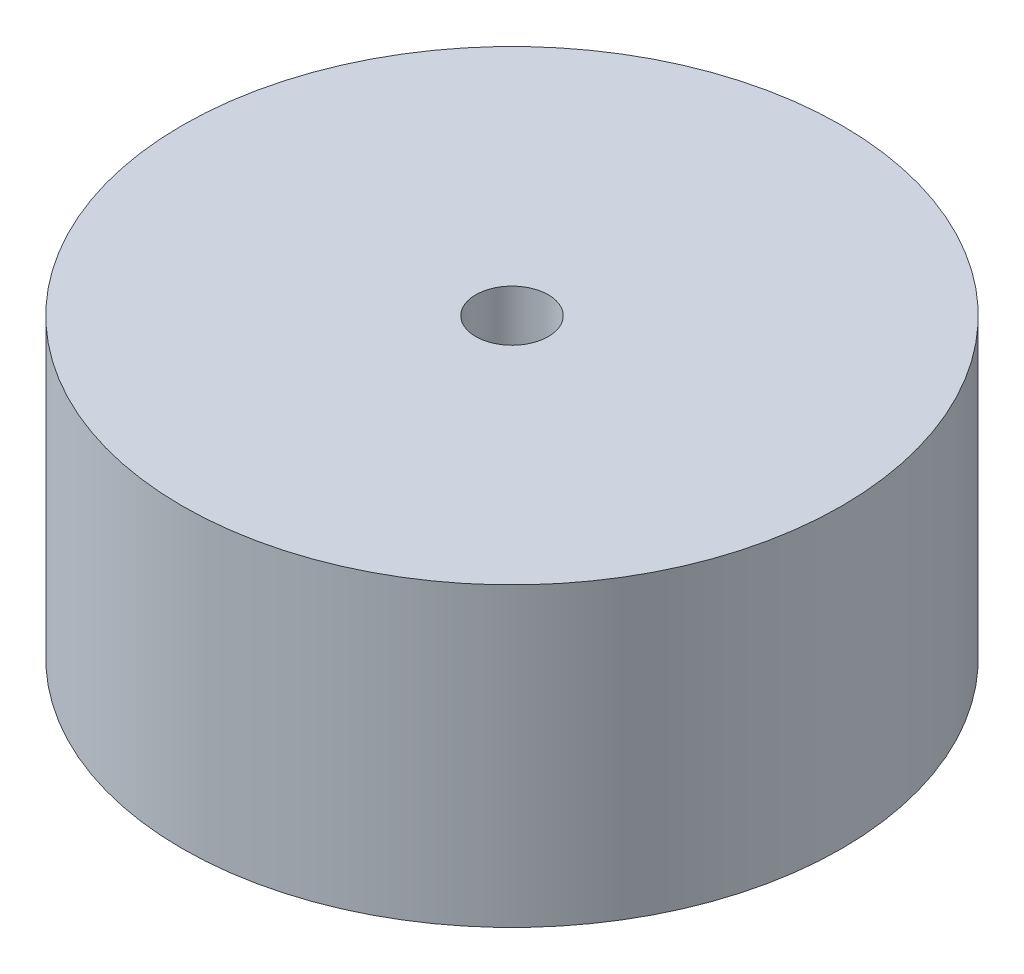
ISO-10303-21;
HEADER;
FILE_DESCRIPTION(('STEP AP214'),'2;1');
FILE_NAME('part.step','',(''),(''),'','','');
FILE_SCHEMA(('AUTOMOTIVE_DESIGN { 1 0 10303 214 1 1 1 1 }'));
ENDSEC;
DATA;
#1=APPLICATION_CONTEXT('core data for automotive mechanical design processes');
#2=APPLICATION_PROTOCOL_DEFINITION('international standard','automotive_design',2000,#1);
#3=PRODUCT_CONTEXT('',#1,'mechanical');
#4=PRODUCT('Part','Part','',(#3));
#5=PRODUCT_RELATED_PRODUCT_CATEGORY('part','',(#4));
#6=PRODUCT_DEFINITION_FORMATION('','',#4);
#7=PRODUCT_DEFINITION_CONTEXT('part definition',#1,'design');
#8=PRODUCT_DEFINITION('design','',#6,#7);
#9=PRODUCT_DEFINITION_SHAPE('','',#8);
#10=(LENGTH_UNIT() NAMED_UNIT(*) SI_UNIT(.MILLI.,.METRE.));
#11=(NAMED_UNIT(*) PLANE_ANGLE_UNIT() SI_UNIT($,.RADIAN.));
#12=(NAMED_UNIT(*) SI_UNIT($,.STERADIAN.) SOLID_ANGLE_UNIT());
#13=UNCERTAINTY_MEASURE_WITH_UNIT(LENGTH_MEASURE(1.E-05),#10,'distance_accuracy_value','');
#14=(GEOMETRIC_REPRESENTATION_CONTEXT(3) GLOBAL_UNCERTAINTY_ASSIGNED_CONTEXT((#13)) GLOBAL_UNIT_ASSIGNED_CONTEXT((#10,
#11,#12)) REPRESENTATION_CONTEXT('',''));
#15=CARTESIAN_POINT('',(0.,0.,0.));
#16=DIRECTION('',(0.,0.,1.));
#17=DIRECTION('',(1.,0.,0.));
#18=AXIS2_PLACEMENT_3D('',#15,#16,#17);
#19=CARTESIAN_POINT('',(0.,45.,0.));
#20=DIRECTION('',(0.,1.,0.));
#21=DIRECTION('',(0.,0.,1.));
#22=AXIS2_PLACEMENT_3D('',#19,#20,#21);
#23=PLANE('',#22);
#24=CARTESIAN_POINT('',(0.,45.,0.));
#25=DIRECTION('',(0.,1.,0.));
#26=DIRECTION('',(0.,0.,1.));
#27=AXIS2_PLACEMENT_3D('',#24,#25,#26);
#28=CIRCLE('',#27,50.);
#29=CARTESIAN_POINT('',(0.,45.,-50.));
#30=VERTEX_POINT('',#29);
#31=EDGE_CURVE('E10',#30,#30,#28,.T.);
#32=ORIENTED_EDGE('',*,*,#31,.T.);
#33=EDGE_LOOP('',(#32));
#34=FACE_BOUND('',#33,.T.);
#35=CARTESIAN_POINT('',(0.,45.,0.));
#36=DIRECTION('',(0.,1.,0.));
#37=DIRECTION('',(0.,0.,1.));
#38=AXIS2_PLACEMENT_3D('',#35,#36,#37);
#39=CIRCLE('',#38,5.5);
#40=CARTESIAN_POINT('',(0.,45.,-5.5));
#41=VERTEX_POINT('',#40);
#42=EDGE_CURVE('E55',#41,#41,#39,.T.);
#43=ORIENTED_EDGE('',*,*,#42,.F.);
#44=EDGE_LOOP('',(#43));
#45=FACE_BOUND('',#44,.T.);
#46=ADVANCED_FACE('F42',(#34,#45),#23,.T.);
#47=CARTESIAN_POINT('',(0.,0.,0.));
#48=DIRECTION('',(0.,1.,0.));
#49=DIRECTION('',(0.,0.,1.));
#50=AXIS2_PLACEMENT_3D('',#47,#48,#49);
#51=PLANE('',#50);
#52=CARTESIAN_POINT('',(0.,0.,0.));
#53=DIRECTION('',(0.,1.,0.));
#54=DIRECTION('',(0.,0.,1.));
#55=AXIS2_PLACEMENT_3D('',#52,#53,#54);
#56=CIRCLE('',#55,50.);
#57=CARTESIAN_POINT('',(0.,0.,-50.));
#58=VERTEX_POINT('',#57);
#59=EDGE_CURVE('E46',#58,#58,#56,.T.);
#60=ORIENTED_EDGE('',*,*,#59,.F.);
#61=EDGE_LOOP('',(#60));
#62=FACE_BOUND('',#61,.T.);
#63=CARTESIAN_POINT('',(0.,0.,0.));
#64=DIRECTION('',(0.,1.,0.));
#65=DIRECTION('',(0.,0.,1.));
#66=AXIS2_PLACEMENT_3D('',#63,#64,#65);
#67=CIRCLE('',#66,5.5);
#68=CARTESIAN_POINT('',(0.,0.,-5.5));
#69=VERTEX_POINT('',#68);
#70=EDGE_CURVE('E57',#69,#69,#67,.T.);
#71=ORIENTED_EDGE('',*,*,#70,.T.);
#72=EDGE_LOOP('',(#71));
#73=FACE_BOUND('',#72,.T.);
#74=ADVANCED_FACE('F69',(#62,#73),#51,.F.);
#75=CARTESIAN_POINT('',(0.,45.,0.));
#76=DIRECTION('',(0.,-1.,0.));
#77=DIRECTION('',(0.,0.,-1.));
#78=AXIS2_PLACEMENT_3D('',#75,#76,#77);
#79=CYLINDRICAL_SURFACE('',#78,50.);
#80=CARTESIAN_POINT('',(0.,45.,-50.));
#81=CARTESIAN_POINT('',(0.,44.53125,-50.));
#82=CARTESIAN_POINT('',(0.,44.0625,-50.));
#83=CARTESIAN_POINT('',(0.,43.125,-50.));
#84=CARTESIAN_POINT('',(0.,42.65625,-50.));
#85=CARTESIAN_POINT('',(0.,41.71875,-50.));
#86=CARTESIAN_POINT('',(0.,41.25,-50.));
#87=CARTESIAN_POINT('',(0.,40.3125,-50.));
#88=CARTESIAN_POINT('',(0.,39.84375,-50.));
#89=CARTESIAN_POINT('',(0.,38.90625,-50.));
#90=CARTESIAN_POINT('',(0.,38.4375,-50.));
#91=CARTESIAN_POINT('',(0.,37.5,-50.));
#92=CARTESIAN_POINT('',(0.,37.03125,-50.));
#93=CARTESIAN_POINT('',(0.,36.09375,-50.));
#94=CARTESIAN_POINT('',(0.,35.625,-50.));
#95=CARTESIAN_POINT('',(0.,34.6875,-50.));
#96=CARTESIAN_POINT('',(0.,34.21875,-50.));
#97=CARTESIAN_POINT('',(0.,33.28125,-50.));
#98=CARTESIAN_POINT('',(0.,32.8125,-50.));
#99=CARTESIAN_POINT('',(0.,31.875,-50.));
#100=CARTESIAN_POINT('',(0.,31.40625,-50.));
#101=CARTESIAN_POINT('',(0.,30.46875,-50.));
#102=CARTESIAN_POINT('',(0.,30.,-50.));
#103=CARTESIAN_POINT('',(0.,29.0625,-50.));
#104=CARTESIAN_POINT('',(0.,28.59375,-50.));
#105=CARTESIAN_POINT('',(0.,27.65625,-50.));
#106=CARTESIAN_POINT('',(0.,27.1875,-50.));
#107=CARTESIAN_POINT('',(0.,26.25,-50.));
#108=CARTESIAN_POINT('',(0.,25.78125,-50.));
#109=CARTESIAN_POINT('',(0.,24.84375,-50.));
#110=CARTESIAN_POINT('',(0.,24.375,-50.));
#111=CARTESIAN_POINT('',(0.,23.4375,-50.));
#112=CARTESIAN_POINT('',(0.,22.96875,-50.));
#113=CARTESIAN_POINT('',(0.,22.03125,-50.));
#114=CARTESIAN_POINT('',(0.,21.5625,-50.));
#115=CARTESIAN_POINT('',(0.,20.625,-50.));
#116=CARTESIAN_POINT('',(0.,20.15625,-50.));
#117=CARTESIAN_POINT('',(0.,19.21875,-50.));
#118=CARTESIAN_POINT('',(0.,18.75,-50.));
#119=CARTESIAN_POINT('',(0.,17.8125,-50.));
#120=CARTESIAN_POINT('',(0.,17.34375,-50.));
#121=CARTESIAN_POINT('',(0.,16.40625,-50.));
#122=CARTESIAN_POINT('',(0.,15.9375,-50.));
#123=CARTESIAN_POINT('',(0.,15.,-50.));
#124=CARTESIAN_POINT('',(0.,14.53125,-50.));
#125=CARTESIAN_POINT('',(0.,13.59375,-50.));
#126=CARTESIAN_POINT('',(0.,13.125,-50.));
#127=CARTESIAN_POINT('',(0.,12.1875,-50.));
#128=CARTESIAN_POINT('',(0.,11.71875,-50.));
#129=CARTESIAN_POINT('',(0.,10.78125,-50.));
#130=CARTESIAN_POINT('',(0.,10.3125,-50.));
#131=CARTESIAN_POINT('',(0.,9.375,-50.));
#132=CARTESIAN_POINT('',(0.,8.90625,-50.));
#133=CARTESIAN_POINT('',(0.,7.96874999999999,-50.));
#134=CARTESIAN_POINT('',(0.,7.5,-50.));
#135=CARTESIAN_POINT('',(0.,6.5625,-50.));
#136=CARTESIAN_POINT('',(0.,6.09375,-50.));
#137=CARTESIAN_POINT('',(0.,5.15625,-50.));
#138=CARTESIAN_POINT('',(0.,4.68749999999999,-50.));
#139=CARTESIAN_POINT('',(0.,3.74999999999999,-50.));
#140=CARTESIAN_POINT('',(0.,3.28124999999999,-50.));
#141=CARTESIAN_POINT('',(0.,2.34374999999999,-50.));
#142=CARTESIAN_POINT('',(0.,1.87499999999999,-50.));
#143=CARTESIAN_POINT('',(0.,0.937499999999992,-50.));
#144=CARTESIAN_POINT('',(0.,0.468749999999993,-50.));
#145=CARTESIAN_POINT('',(0.,0.,-50.));
#146=B_SPLINE_CURVE_WITH_KNOTS('',3,(#80,#81,#82,#83,#84,#85,#86,#87,#88,#89,#90,#91,#92,#93,
#94,#95,#96,#97,#98,#99,#100,#101,#102,#103,#104,#105,#106,#107,#108,#109,#110,#111,#112,#113,
#114,#115,#116,#117,#118,#119,#120,#121,#122,#123,#124,#125,#126,#127,#128,#129,#130,#131,#132,
#133,#134,#135,#136,#137,#138,#139,#140,#141,#142,#143,#144,#145),.UNSPECIFIED.,.F.,.F.,(4,2,2,
2,2,2,2,2,2,2,2,2,2,2,2,2,2,2,2,2,2,2,2,2,2,2,2,2,2,2,2,2,4),(0.,1.40625,2.8125,
4.21875000000001,5.62500000000001,7.03125,8.4375,9.84375000000001,11.25,12.65625,14.0625,
15.46875,16.875,18.28125,19.6875,21.09375,22.5,23.90625,25.3125,26.71875,28.125,29.53125,
30.9375,32.34375,33.75,35.15625,36.5625,37.96875,39.375,40.78125,42.1875,43.59375,45.),.UNSPECIFIED.);
#147=EDGE_CURVE('BSEAM44',#30,#58,#146,.T.);
#148=ORIENTED_EDGE('',*,*,#31,.F.);
#149=ORIENTED_EDGE('',*,*,#59,.T.);
#150=ORIENTED_EDGE('',*,*,#147,.T.);
#151=ORIENTED_EDGE('',*,*,#147,.F.);
#152=EDGE_LOOP('',(#148,#150,#149,#151));
#153=FACE_BOUND('',#152,.T.);
#154=ADVANCED_FACE('F44',(#153),#79,.T.);
#155=CARTESIAN_POINT('',(0.,45.,0.));
#156=DIRECTION('',(0.,-1.,0.));
#157=DIRECTION('',(0.,0.,-1.));
#158=AXIS2_PLACEMENT_3D('',#155,#156,#157);
#159=CYLINDRICAL_SURFACE('',#158,5.5);
#160=CARTESIAN_POINT('',(0.,45.,-5.5));
#161=CARTESIAN_POINT('',(0.,44.53125,-5.5));
#162=CARTESIAN_POINT('',(0.,44.0625,-5.5));
#163=CARTESIAN_POINT('',(0.,43.125,-5.5));
#164=CARTESIAN_POINT('',(0.,42.65625,-5.5));
#165=CARTESIAN_POINT('',(0.,41.71875,-5.5));
#166=CARTESIAN_POINT('',(0.,41.25,-5.5));
#167=CARTESIAN_POINT('',(0.,40.3125,-5.5));
#168=CARTESIAN_POINT('',(0.,39.84375,-5.5));
#169=CARTESIAN_POINT('',(0.,38.90625,-5.5));
#170=CARTESIAN_POINT('',(0.,38.4375,-5.5));
#171=CARTESIAN_POINT('',(0.,37.5,-5.5));
#172=CARTESIAN_POINT('',(0.,37.03125,-5.5));
#173=CARTESIAN_POINT('',(0.,36.09375,-5.5));
#174=CARTESIAN_POINT('',(0.,35.625,-5.5));
#175=CARTESIAN_POINT('',(0.,34.6875,-5.5));
#176=CARTESIAN_POINT('',(0.,34.21875,-5.5));
#177=CARTESIAN_POINT('',(0.,33.28125,-5.5));
#178=CARTESIAN_POINT('',(0.,32.8125,-5.5));
#179=CARTESIAN_POINT('',(0.,31.875,-5.5));
#180=CARTESIAN_POINT('',(0.,31.40625,-5.5));
#181=CARTESIAN_POINT('',(0.,30.46875,-5.5));
#182=CARTESIAN_POINT('',(0.,30.,-5.5));
#183=CARTESIAN_POINT('',(0.,29.0625,-5.5));
#184=CARTESIAN_POINT('',(0.,28.59375,-5.5));
#185=CARTESIAN_POINT('',(0.,27.65625,-5.5));
#186=CARTESIAN_POINT('',(0.,27.1875,-5.5));
#187=CARTESIAN_POINT('',(0.,26.25,-5.5));
#188=CARTESIAN_POINT('',(0.,25.78125,-5.5));
#189=CARTESIAN_POINT('',(0.,24.84375,-5.5));
#190=CARTESIAN_POINT('',(0.,24.375,-5.5));
#191=CARTESIAN_POINT('',(0.,23.4375,-5.5));
#192=CARTESIAN_POINT('',(0.,22.96875,-5.5));
#193=CARTESIAN_POINT('',(0.,22.03125,-5.5));
#194=CARTESIAN_POINT('',(0.,21.5625,-5.5));
#195=CARTESIAN_POINT('',(0.,20.625,-5.5));
#196=CARTESIAN_POINT('',(0.,20.15625,-5.5));
#197=CARTESIAN_POINT('',(0.,19.21875,-5.5));
#198=CARTESIAN_POINT('',(0.,18.75,-5.5));
#199=CARTESIAN_POINT('',(0.,17.8125,-5.5));
#200=CARTESIAN_POINT('',(0.,17.34375,-5.5));
#201=CARTESIAN_POINT('',(0.,16.40625,-5.5));
#202=CARTESIAN_POINT('',(0.,15.9375,-5.5));
#203=CARTESIAN_POINT('',(0.,15.,-5.5));
#204=CARTESIAN_POINT('',(0.,14.53125,-5.5));
#205=CARTESIAN_POINT('',(0.,13.59375,-5.5));
#206=CARTESIAN_POINT('',(0.,13.125,-5.5));
#207=CARTESIAN_POINT('',(0.,12.1875,-5.5));
#208=CARTESIAN_POINT('',(0.,11.71875,-5.5));
#209=CARTESIAN_POINT('',(0.,10.78125,-5.5));
#210=CARTESIAN_POINT('',(0.,10.3125,-5.5));
#211=CARTESIAN_POINT('',(0.,9.375,-5.5));
#212=CARTESIAN_POINT('',(0.,8.90625,-5.5));
#213=CARTESIAN_POINT('',(0.,7.96874999999999,-5.5));
#214=CARTESIAN_POINT('',(0.,7.5,-5.5));
#215=CARTESIAN_POINT('',(0.,6.5625,-5.5));
#216=CARTESIAN_POINT('',(0.,6.09375,-5.5));
#217=CARTESIAN_POINT('',(0.,5.15625,-5.5));
#218=CARTESIAN_POINT('',(0.,4.68749999999999,-5.5));
#219=CARTESIAN_POINT('',(0.,3.74999999999999,-5.5));
#220=CARTESIAN_POINT('',(0.,3.28124999999999,-5.5));
#221=CARTESIAN_POINT('',(0.,2.34374999999999,-5.5));
#222=CARTESIAN_POINT('',(0.,1.87499999999999,-5.5));
#223=CARTESIAN_POINT('',(0.,0.937499999999992,-5.5));
#224=CARTESIAN_POINT('',(0.,0.468749999999993,-5.5));
#225=CARTESIAN_POINT('',(0.,0.,-5.5));
#226=B_SPLINE_CURVE_WITH_KNOTS('',3,(#160,#161,#162,#163,#164,#165,#166,#167,#168,#169,#170,
#171,#172,#173,#174,#175,#176,#177,#178,#179,#180,#181,#182,#183,#184,#185,#186,#187,#188,#189,
#190,#191,#192,#193,#194,#195,#196,#197,#198,#199,#200,#201,#202,#203,#204,#205,#206,#207,#208,
#209,#210,#211,#212,#213,#214,#215,#216,#217,#218,#219,#220,#221,#222,#223,#224,#225),
.UNSPECIFIED.,.F.,.F.,(4,2,2,2,2,2,2,2,2,2,2,2,2,2,2,2,2,2,2,2,2,2,2,2,2,2,2,2,2,2,2,2,4),(0.,
1.40625,2.8125,4.21875000000001,5.62500000000001,7.03125,8.4375,9.84375000000001,11.25,12.65625,
14.0625,15.46875,16.875,18.28125,19.6875,21.09375,22.5,23.90625,25.3125,26.71875,28.125,
29.53125,30.9375,32.34375,33.75,35.15625,36.5625,37.96875,39.375,40.78125,42.1875,43.59375,45.),.UNSPECIFIED.);
#227=EDGE_CURVE('BSEAM65',#41,#69,#226,.T.);
#228=ORIENTED_EDGE('',*,*,#42,.T.);
#229=ORIENTED_EDGE('',*,*,#70,.F.);
#230=ORIENTED_EDGE('',*,*,#227,.T.);
#231=ORIENTED_EDGE('',*,*,#227,.F.);
#232=EDGE_LOOP('',(#228,#230,#229,#231));
#233=FACE_BOUND('',#232,.T.);
#234=ADVANCED_FACE('F65',(#233),#159,.F.);
#235=CLOSED_SHELL('',(#46,#74,#154,#234));
#236=MANIFOLD_SOLID_BREP('B2',#235);
#237=ADVANCED_BREP_SHAPE_REPRESENTATION('',(#18,#236),#14);
#238=SHAPE_DEFINITION_REPRESENTATION(#9,#237);
ENDSEC;
END-ISO-10303-21;
